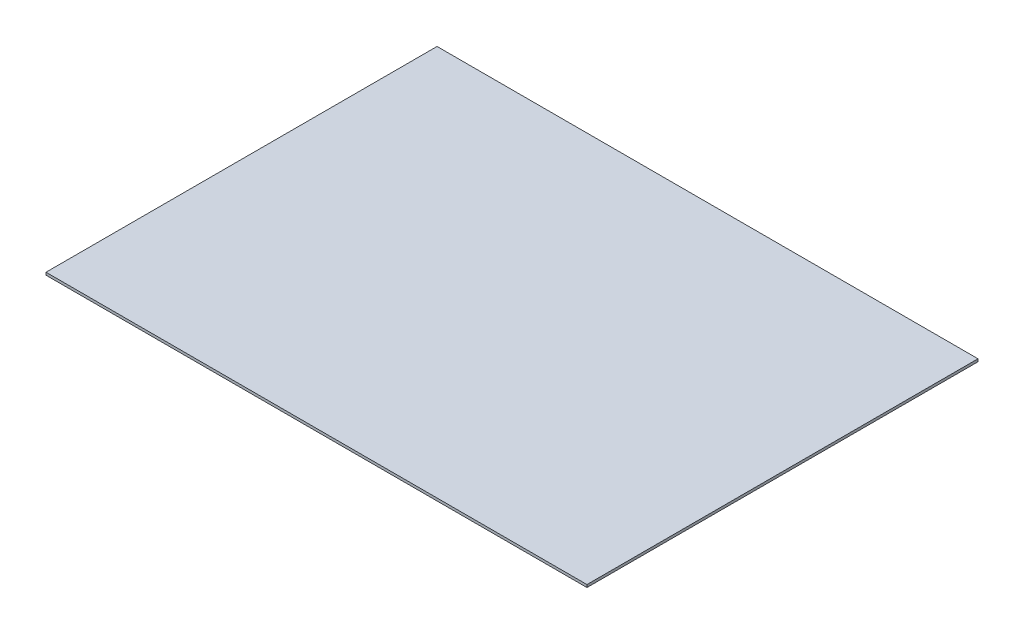
ISO-10303-21;
HEADER;
FILE_DESCRIPTION(('STEP AP214'),'2;1');
FILE_NAME('part.step','',(''),(''),'','','');
FILE_SCHEMA(('AUTOMOTIVE_DESIGN { 1 0 10303 214 1 1 1 1 }'));
ENDSEC;
DATA;
#1=APPLICATION_CONTEXT('core data for automotive mechanical design processes');
#2=APPLICATION_PROTOCOL_DEFINITION('international standard','automotive_design',2000,#1);
#3=PRODUCT_CONTEXT('',#1,'mechanical');
#4=PRODUCT('Part','Part','',(#3));
#5=PRODUCT_RELATED_PRODUCT_CATEGORY('part','',(#4));
#6=PRODUCT_DEFINITION_FORMATION('','',#4);
#7=PRODUCT_DEFINITION_CONTEXT('part definition',#1,'design');
#8=PRODUCT_DEFINITION('design','',#6,#7);
#9=PRODUCT_DEFINITION_SHAPE('','',#8);
#10=(LENGTH_UNIT() NAMED_UNIT(*) SI_UNIT(.MILLI.,.METRE.));
#11=(NAMED_UNIT(*) PLANE_ANGLE_UNIT() SI_UNIT($,.RADIAN.));
#12=(NAMED_UNIT(*) SI_UNIT($,.STERADIAN.) SOLID_ANGLE_UNIT());
#13=UNCERTAINTY_MEASURE_WITH_UNIT(LENGTH_MEASURE(1.E-05),#10,'distance_accuracy_value','');
#14=(GEOMETRIC_REPRESENTATION_CONTEXT(3) GLOBAL_UNCERTAINTY_ASSIGNED_CONTEXT((#13)) GLOBAL_UNIT_ASSIGNED_CONTEXT((#10,
#11,#12)) REPRESENTATION_CONTEXT('',''));
#15=CARTESIAN_POINT('',(0.,0.,0.));
#16=DIRECTION('',(0.,0.,1.));
#17=DIRECTION('',(1.,0.,0.));
#18=AXIS2_PLACEMENT_3D('',#15,#16,#17);
#19=CARTESIAN_POINT('',(0.,0.,0.));
#20=DIRECTION('',(0.,1.,0.));
#21=DIRECTION('',(0.,0.,1.));
#22=AXIS2_PLACEMENT_3D('',#19,#20,#21);
#23=PLANE('',#22);
#24=DIRECTION('',(0.,0.,-1.));
#25=VECTOR('',#24,1.);
#26=CARTESIAN_POINT('',(209.965722120658,0.,-135.804387568556));
#27=LINE('',#26,#25);
#28=CARTESIAN_POINT('',(209.965722120658,0.,164.195612431444));
#29=VERTEX_POINT('',#28);
#30=CARTESIAN_POINT('',(209.965722120658,0.,-135.804387568556));
#31=VERTEX_POINT('',#30);
#32=EDGE_CURVE('E166',#29,#31,#27,.T.);
#33=ORIENTED_EDGE('',*,*,#32,.F.);
#34=DIRECTION('',(1.,0.,0.));
#35=VECTOR('',#34,1.);
#36=CARTESIAN_POINT('',(-205.034277879342,0.,164.195612431444));
#37=LINE('',#36,#35);
#38=CARTESIAN_POINT('',(-205.034277879342,0.,164.195612431444));
#39=VERTEX_POINT('',#38);
#40=EDGE_CURVE('E183',#39,#29,#37,.T.);
#41=ORIENTED_EDGE('',*,*,#40,.F.);
#42=DIRECTION('',(0.,0.,1.));
#43=VECTOR('',#42,1.);
#44=CARTESIAN_POINT('',(-205.034277879342,0.,-135.804387568556));
#45=LINE('',#44,#43);
#46=CARTESIAN_POINT('',(-205.034277879342,0.,-135.804387568556));
#47=VERTEX_POINT('',#46);
#48=EDGE_CURVE('E194',#47,#39,#45,.T.);
#49=ORIENTED_EDGE('',*,*,#48,.F.);
#50=DIRECTION('',(-1.,0.,0.));
#51=VECTOR('',#50,1.);
#52=CARTESIAN_POINT('',(-205.034277879342,0.,-135.804387568556));
#53=LINE('',#52,#51);
#54=EDGE_CURVE('E192',#31,#47,#53,.T.);
#55=ORIENTED_EDGE('',*,*,#54,.F.);
#56=EDGE_LOOP('',(#33,#41,#49,#55));
#57=FACE_BOUND('',#56,.T.);
#58=DIRECTION('',(1.,0.,0.));
#59=VECTOR('',#58,1.);
#60=CARTESIAN_POINT('',(0.,0.,-120.804387568556));
#61=LINE('',#60,#59);
#62=CARTESIAN_POINT('',(-190.034277879342,0.,-120.804387568556));
#63=VERTEX_POINT('',#62);
#64=CARTESIAN_POINT('',(194.965722120658,0.,-120.804387568556));
#65=VERTEX_POINT('',#64);
#66=EDGE_CURVE('E11',#63,#65,#61,.T.);
#67=ORIENTED_EDGE('',*,*,#66,.F.);
#68=DIRECTION('',(0.,0.,1.));
#69=VECTOR('',#68,1.);
#70=CARTESIAN_POINT('',(-190.034277879342,0.,0.));
#71=LINE('',#70,#69);
#72=CARTESIAN_POINT('',(-190.034277879342,0.,149.195612431444));
#73=VERTEX_POINT('',#72);
#74=EDGE_CURVE('E131',#63,#73,#71,.T.);
#75=ORIENTED_EDGE('',*,*,#74,.T.);
#76=DIRECTION('',(1.,0.,0.));
#77=VECTOR('',#76,1.);
#78=CARTESIAN_POINT('',(0.,0.,149.195612431444));
#79=LINE('',#78,#77);
#80=CARTESIAN_POINT('',(194.965722120658,0.,149.195612431444));
#81=VERTEX_POINT('',#80);
#82=EDGE_CURVE('E219',#73,#81,#79,.T.);
#83=ORIENTED_EDGE('',*,*,#82,.T.);
#84=DIRECTION('',(0.,0.,1.));
#85=VECTOR('',#84,1.);
#86=CARTESIAN_POINT('',(194.965722120658,0.,0.));
#87=LINE('',#86,#85);
#88=EDGE_CURVE('E47',#65,#81,#87,.T.);
#89=ORIENTED_EDGE('',*,*,#88,.F.);
#90=EDGE_LOOP('',(#67,#75,#83,#89));
#91=FACE_BOUND('',#90,.T.);
#92=ADVANCED_FACE('F39',(#57,#91),#23,.F.);
#93=CARTESIAN_POINT('',(209.965722120658,2.,-135.804387568556));
#94=DIRECTION('',(-1.,0.,0.));
#95=DIRECTION('',(0.,0.,1.));
#96=AXIS2_PLACEMENT_3D('',#93,#94,#95);
#97=PLANE('',#96);
#98=ORIENTED_EDGE('',*,*,#32,.T.);
#99=DIRECTION('',(0.,-1.,0.));
#100=VECTOR('',#99,1.);
#101=CARTESIAN_POINT('',(209.965722120658,2.,-135.804387568556));
#102=LINE('',#101,#100);
#103=CARTESIAN_POINT('',(209.965722120658,2.,-135.804387568556));
#104=VERTEX_POINT('',#103);
#105=EDGE_CURVE('E205',#104,#31,#102,.T.);
#106=ORIENTED_EDGE('',*,*,#105,.F.);
#107=DIRECTION('',(0.,0.,-1.));
#108=VECTOR('',#107,1.);
#109=CARTESIAN_POINT('',(209.965722120658,2.,-135.804387568556));
#110=LINE('',#109,#108);
#111=CARTESIAN_POINT('',(209.965722120658,2.,164.195612431444));
#112=VERTEX_POINT('',#111);
#113=EDGE_CURVE('E179',#112,#104,#110,.T.);
#114=ORIENTED_EDGE('',*,*,#113,.F.);
#115=DIRECTION('',(0.,-1.,0.));
#116=VECTOR('',#115,1.);
#117=CARTESIAN_POINT('',(209.965722120658,2.,164.195612431444));
#118=LINE('',#117,#116);
#119=EDGE_CURVE('E189',#112,#29,#118,.T.);
#120=ORIENTED_EDGE('',*,*,#119,.T.);
#121=EDGE_LOOP('',(#98,#106,#114,#120));
#122=FACE_BOUND('',#121,.T.);
#123=ADVANCED_FACE('F41',(#122),#97,.F.);
#124=CARTESIAN_POINT('',(-205.034277879342,2.,-135.804387568556));
#125=DIRECTION('',(0.,0.,1.));
#126=DIRECTION('',(1.,0.,0.));
#127=AXIS2_PLACEMENT_3D('',#124,#125,#126);
#128=PLANE('',#127);
#129=ORIENTED_EDGE('',*,*,#54,.T.);
#130=DIRECTION('',(0.,-1.,0.));
#131=VECTOR('',#130,1.);
#132=CARTESIAN_POINT('',(-205.034277879342,2.,-135.804387568556));
#133=LINE('',#132,#131);
#134=CARTESIAN_POINT('',(-205.034277879342,2.,-135.804387568556));
#135=VERTEX_POINT('',#134);
#136=EDGE_CURVE('E202',#135,#47,#133,.T.);
#137=ORIENTED_EDGE('',*,*,#136,.F.);
#138=DIRECTION('',(-1.,0.,0.));
#139=VECTOR('',#138,1.);
#140=CARTESIAN_POINT('',(-205.034277879342,2.,-135.804387568556));
#141=LINE('',#140,#139);
#142=EDGE_CURVE('E182',#104,#135,#141,.T.);
#143=ORIENTED_EDGE('',*,*,#142,.F.);
#144=ORIENTED_EDGE('',*,*,#105,.T.);
#145=EDGE_LOOP('',(#129,#137,#143,#144));
#146=FACE_BOUND('',#145,.T.);
#147=ADVANCED_FACE('F235',(#146),#128,.F.);
#148=CARTESIAN_POINT('',(-205.034277879342,2.,-135.804387568556));
#149=DIRECTION('',(1.,0.,0.));
#150=DIRECTION('',(0.,0.,-1.));
#151=AXIS2_PLACEMENT_3D('',#148,#149,#150);
#152=PLANE('',#151);
#153=ORIENTED_EDGE('',*,*,#48,.T.);
#154=DIRECTION('',(0.,-1.,0.));
#155=VECTOR('',#154,1.);
#156=CARTESIAN_POINT('',(-205.034277879342,2.,164.195612431444));
#157=LINE('',#156,#155);
#158=CARTESIAN_POINT('',(-205.034277879342,2.,164.195612431444));
#159=VERTEX_POINT('',#158);
#160=EDGE_CURVE('E199',#159,#39,#157,.T.);
#161=ORIENTED_EDGE('',*,*,#160,.F.);
#162=DIRECTION('',(0.,0.,1.));
#163=VECTOR('',#162,1.);
#164=CARTESIAN_POINT('',(-205.034277879342,2.,-135.804387568556));
#165=LINE('',#164,#163);
#166=EDGE_CURVE('E185',#135,#159,#165,.T.);
#167=ORIENTED_EDGE('',*,*,#166,.F.);
#168=ORIENTED_EDGE('',*,*,#136,.T.);
#169=EDGE_LOOP('',(#153,#161,#167,#168));
#170=FACE_BOUND('',#169,.T.);
#171=ADVANCED_FACE('F282',(#170),#152,.F.);
#172=CARTESIAN_POINT('',(-205.034277879342,2.,164.195612431444));
#173=DIRECTION('',(0.,0.,-1.));
#174=DIRECTION('',(-1.,0.,0.));
#175=AXIS2_PLACEMENT_3D('',#172,#173,#174);
#176=PLANE('',#175);
#177=ORIENTED_EDGE('',*,*,#40,.T.);
#178=ORIENTED_EDGE('',*,*,#119,.F.);
#179=DIRECTION('',(1.,0.,0.));
#180=VECTOR('',#179,1.);
#181=CARTESIAN_POINT('',(-205.034277879342,2.,164.195612431444));
#182=LINE('',#181,#180);
#183=EDGE_CURVE('E187',#159,#112,#182,.T.);
#184=ORIENTED_EDGE('',*,*,#183,.F.);
#185=ORIENTED_EDGE('',*,*,#160,.T.);
#186=EDGE_LOOP('',(#177,#178,#184,#185));
#187=FACE_BOUND('',#186,.T.);
#188=ADVANCED_FACE('F277',(#187),#176,.F.);
#189=CARTESIAN_POINT('',(0.,2.,0.));
#190=DIRECTION('',(0.,1.,0.));
#191=DIRECTION('',(0.,0.,1.));
#192=AXIS2_PLACEMENT_3D('',#189,#190,#191);
#193=PLANE('',#192);
#194=ORIENTED_EDGE('',*,*,#113,.T.);
#195=ORIENTED_EDGE('',*,*,#142,.T.);
#196=ORIENTED_EDGE('',*,*,#166,.T.);
#197=ORIENTED_EDGE('',*,*,#183,.T.);
#198=EDGE_LOOP('',(#194,#195,#196,#197));
#199=FACE_BOUND('',#198,.T.);
#200=ADVANCED_FACE('F270',(#199),#193,.T.);
#201=CARTESIAN_POINT('',(-185.034277879342,-8.,0.));
#202=DIRECTION('',(-1.,0.,0.));
#203=DIRECTION('',(0.,0.,1.));
#204=AXIS2_PLACEMENT_3D('',#201,#202,#203);
#205=PLANE('',#204);
#206=DIRECTION('',(0.,1.,0.));
#207=VECTOR('',#206,1.);
#208=CARTESIAN_POINT('',(-185.034277879342,-8.,-115.804387568556));
#209=LINE('',#208,#207);
#210=CARTESIAN_POINT('',(-185.034277879342,-8.,-115.804387568556));
#211=VERTEX_POINT('',#210);
#212=CARTESIAN_POINT('',(-185.034277879342,0.,-115.804387568556));
#213=VERTEX_POINT('',#212);
#214=EDGE_CURVE('E171',#211,#213,#209,.T.);
#215=ORIENTED_EDGE('',*,*,#214,.T.);
#216=DIRECTION('',(0.,0.,1.));
#217=VECTOR('',#216,1.);
#218=CARTESIAN_POINT('',(-185.034277879342,0.,0.));
#219=LINE('',#218,#217);
#220=CARTESIAN_POINT('',(-185.034277879342,0.,144.195612431444));
#221=VERTEX_POINT('',#220);
#222=EDGE_CURVE('E216',#213,#221,#219,.T.);
#223=ORIENTED_EDGE('',*,*,#222,.T.);
#224=DIRECTION('',(0.,1.,0.));
#225=VECTOR('',#224,1.);
#226=CARTESIAN_POINT('',(-185.034277879342,-8.,144.195612431444));
#227=LINE('',#226,#225);
#228=CARTESIAN_POINT('',(-185.034277879342,-8.,144.195612431444));
#229=VERTEX_POINT('',#228);
#230=EDGE_CURVE('E163',#229,#221,#227,.T.);
#231=ORIENTED_EDGE('',*,*,#230,.F.);
#232=DIRECTION('',(0.,0.,1.));
#233=VECTOR('',#232,1.);
#234=CARTESIAN_POINT('',(-185.034277879342,-8.,0.));
#235=LINE('',#234,#233);
#236=EDGE_CURVE('E154',#211,#229,#235,.T.);
#237=ORIENTED_EDGE('',*,*,#236,.F.);
#238=EDGE_LOOP('',(#215,#223,#231,#237));
#239=FACE_BOUND('',#238,.T.);
#240=ADVANCED_FACE('F251',(#239),#205,.F.);
#241=CARTESIAN_POINT('',(0.,-8.,144.195612431444));
#242=DIRECTION('',(0.,0.,1.));
#243=DIRECTION('',(1.,0.,0.));
#244=AXIS2_PLACEMENT_3D('',#241,#242,#243);
#245=PLANE('',#244);
#246=ORIENTED_EDGE('',*,*,#230,.T.);
#247=DIRECTION('',(1.,0.,0.));
#248=VECTOR('',#247,1.);
#249=CARTESIAN_POINT('',(0.,0.,144.195612431444));
#250=LINE('',#249,#248);
#251=CARTESIAN_POINT('',(189.965722120658,0.,144.195612431444));
#252=VERTEX_POINT('',#251);
#253=EDGE_CURVE('E214',#221,#252,#250,.T.);
#254=ORIENTED_EDGE('',*,*,#253,.T.);
#255=DIRECTION('',(0.,1.,0.));
#256=VECTOR('',#255,1.);
#257=CARTESIAN_POINT('',(189.965722120658,-8.,144.195612431444));
#258=LINE('',#257,#256);
#259=CARTESIAN_POINT('',(189.965722120658,-8.,144.195612431444));
#260=VERTEX_POINT('',#259);
#261=EDGE_CURVE('E167',#260,#252,#258,.T.);
#262=ORIENTED_EDGE('',*,*,#261,.F.);
#263=DIRECTION('',(1.,0.,0.));
#264=VECTOR('',#263,1.);
#265=CARTESIAN_POINT('',(0.,-8.,144.195612431444));
#266=LINE('',#265,#264);
#267=EDGE_CURVE('E134',#229,#260,#266,.T.);
#268=ORIENTED_EDGE('',*,*,#267,.F.);
#269=EDGE_LOOP('',(#246,#254,#262,#268));
#270=FACE_BOUND('',#269,.T.);
#271=ADVANCED_FACE('F254',(#270),#245,.F.);
#272=CARTESIAN_POINT('',(189.965722120658,-8.,0.));
#273=DIRECTION('',(-1.,0.,0.));
#274=DIRECTION('',(0.,0.,1.));
#275=AXIS2_PLACEMENT_3D('',#272,#273,#274);
#276=PLANE('',#275);
#277=DIRECTION('',(0.,0.,1.));
#278=VECTOR('',#277,1.);
#279=CARTESIAN_POINT('',(189.965722120658,0.,0.));
#280=LINE('',#279,#278);
#281=CARTESIAN_POINT('',(189.965722120658,0.,-115.804387568556));
#282=VERTEX_POINT('',#281);
#283=EDGE_CURVE('E211',#282,#252,#280,.T.);
#284=ORIENTED_EDGE('',*,*,#283,.F.);
#285=DIRECTION('',(0.,1.,0.));
#286=VECTOR('',#285,1.);
#287=CARTESIAN_POINT('',(189.965722120658,-8.,-115.804387568556));
#288=LINE('',#287,#286);
#289=CARTESIAN_POINT('',(189.965722120658,-8.,-115.804387568556));
#290=VERTEX_POINT('',#289);
#291=EDGE_CURVE('E62',#290,#282,#288,.T.);
#292=ORIENTED_EDGE('',*,*,#291,.F.);
#293=DIRECTION('',(0.,0.,1.));
#294=VECTOR('',#293,1.);
#295=CARTESIAN_POINT('',(189.965722120658,-8.,0.));
#296=LINE('',#295,#294);
#297=EDGE_CURVE('E159',#290,#260,#296,.T.);
#298=ORIENTED_EDGE('',*,*,#297,.T.);
#299=ORIENTED_EDGE('',*,*,#261,.T.);
#300=EDGE_LOOP('',(#284,#292,#298,#299));
#301=FACE_BOUND('',#300,.T.);
#302=ADVANCED_FACE('F266',(#301),#276,.T.);
#303=CARTESIAN_POINT('',(0.,-8.,-120.804387568556));
#304=DIRECTION('',(0.,0.,1.));
#305=DIRECTION('',(1.,0.,0.));
#306=AXIS2_PLACEMENT_3D('',#303,#304,#305);
#307=PLANE('',#306);
#308=DIRECTION('',(0.,1.,0.));
#309=VECTOR('',#308,1.);
#310=CARTESIAN_POINT('',(-190.034277879342,-8.,-120.804387568556));
#311=LINE('',#310,#309);
#312=CARTESIAN_POINT('',(-190.034277879342,-8.,-120.804387568556));
#313=VERTEX_POINT('',#312);
#314=EDGE_CURVE('E125',#313,#63,#311,.T.);
#315=ORIENTED_EDGE('',*,*,#314,.T.);
#316=ORIENTED_EDGE('',*,*,#66,.T.);
#317=DIRECTION('',(0.,1.,0.));
#318=VECTOR('',#317,1.);
#319=CARTESIAN_POINT('',(194.965722120658,-8.,-120.804387568556));
#320=LINE('',#319,#318);
#321=CARTESIAN_POINT('',(194.965722120658,-8.,-120.804387568556));
#322=VERTEX_POINT('',#321);
#323=EDGE_CURVE('E141',#322,#65,#320,.T.);
#324=ORIENTED_EDGE('',*,*,#323,.F.);
#325=DIRECTION('',(1.,0.,0.));
#326=VECTOR('',#325,1.);
#327=CARTESIAN_POINT('',(0.,-8.,-120.804387568556));
#328=LINE('',#327,#326);
#329=EDGE_CURVE('E138',#313,#322,#328,.T.);
#330=ORIENTED_EDGE('',*,*,#329,.F.);
#331=EDGE_LOOP('',(#315,#316,#324,#330));
#332=FACE_BOUND('',#331,.T.);
#333=ADVANCED_FACE('F139',(#332),#307,.F.);
#334=CARTESIAN_POINT('',(194.965722120658,-8.,0.));
#335=DIRECTION('',(-1.,0.,0.));
#336=DIRECTION('',(0.,0.,1.));
#337=AXIS2_PLACEMENT_3D('',#334,#335,#336);
#338=PLANE('',#337);
#339=ORIENTED_EDGE('',*,*,#323,.T.);
#340=ORIENTED_EDGE('',*,*,#88,.T.);
#341=DIRECTION('',(0.,1.,0.));
#342=VECTOR('',#341,1.);
#343=CARTESIAN_POINT('',(194.965722120658,-8.,149.195612431444));
#344=LINE('',#343,#342);
#345=CARTESIAN_POINT('',(194.965722120658,-8.,149.195612431444));
#346=VERTEX_POINT('',#345);
#347=EDGE_CURVE('E175',#346,#81,#344,.T.);
#348=ORIENTED_EDGE('',*,*,#347,.F.);
#349=DIRECTION('',(0.,0.,1.));
#350=VECTOR('',#349,1.);
#351=CARTESIAN_POINT('',(194.965722120658,-8.,0.));
#352=LINE('',#351,#350);
#353=EDGE_CURVE('E150',#322,#346,#352,.T.);
#354=ORIENTED_EDGE('',*,*,#353,.F.);
#355=EDGE_LOOP('',(#339,#340,#348,#354));
#356=FACE_BOUND('',#355,.T.);
#357=ADVANCED_FACE('F224',(#356),#338,.F.);
#358=CARTESIAN_POINT('',(0.,-8.,149.195612431444));
#359=DIRECTION('',(0.,0.,1.));
#360=DIRECTION('',(1.,0.,0.));
#361=AXIS2_PLACEMENT_3D('',#358,#359,#360);
#362=PLANE('',#361);
#363=ORIENTED_EDGE('',*,*,#82,.F.);
#364=DIRECTION('',(0.,1.,0.));
#365=VECTOR('',#364,1.);
#366=CARTESIAN_POINT('',(-190.034277879342,-8.,149.195612431444));
#367=LINE('',#366,#365);
#368=CARTESIAN_POINT('',(-190.034277879342,-8.,149.195612431444));
#369=VERTEX_POINT('',#368);
#370=EDGE_CURVE('E54',#369,#73,#367,.T.);
#371=ORIENTED_EDGE('',*,*,#370,.F.);
#372=DIRECTION('',(1.,0.,0.));
#373=VECTOR('',#372,1.);
#374=CARTESIAN_POINT('',(0.,-8.,149.195612431444));
#375=LINE('',#374,#373);
#376=EDGE_CURVE('E148',#369,#346,#375,.T.);
#377=ORIENTED_EDGE('',*,*,#376,.T.);
#378=ORIENTED_EDGE('',*,*,#347,.T.);
#379=EDGE_LOOP('',(#363,#371,#377,#378));
#380=FACE_BOUND('',#379,.T.);
#381=ADVANCED_FACE('F227',(#380),#362,.T.);
#382=CARTESIAN_POINT('',(-190.034277879342,-8.,0.));
#383=DIRECTION('',(-1.,0.,0.));
#384=DIRECTION('',(0.,0.,1.));
#385=AXIS2_PLACEMENT_3D('',#382,#383,#384);
#386=PLANE('',#385);
#387=ORIENTED_EDGE('',*,*,#74,.F.);
#388=ORIENTED_EDGE('',*,*,#314,.F.);
#389=DIRECTION('',(0.,0.,1.));
#390=VECTOR('',#389,1.);
#391=CARTESIAN_POINT('',(-190.034277879342,-8.,0.));
#392=LINE('',#391,#390);
#393=EDGE_CURVE('E129',#313,#369,#392,.T.);
#394=ORIENTED_EDGE('',*,*,#393,.T.);
#395=ORIENTED_EDGE('',*,*,#370,.T.);
#396=EDGE_LOOP('',(#387,#388,#394,#395));
#397=FACE_BOUND('',#396,.T.);
#398=ADVANCED_FACE('F127',(#397),#386,.T.);
#399=CARTESIAN_POINT('',(0.,-8.,-115.804387568556));
#400=DIRECTION('',(0.,0.,1.));
#401=DIRECTION('',(1.,0.,0.));
#402=AXIS2_PLACEMENT_3D('',#399,#400,#401);
#403=PLANE('',#402);
#404=DIRECTION('',(1.,0.,0.));
#405=VECTOR('',#404,1.);
#406=CARTESIAN_POINT('',(0.,0.,-115.804387568556));
#407=LINE('',#406,#405);
#408=EDGE_CURVE('E208',#213,#282,#407,.T.);
#409=ORIENTED_EDGE('',*,*,#408,.F.);
#410=ORIENTED_EDGE('',*,*,#214,.F.);
#411=DIRECTION('',(1.,0.,0.));
#412=VECTOR('',#411,1.);
#413=CARTESIAN_POINT('',(0.,-8.,-115.804387568556));
#414=LINE('',#413,#412);
#415=EDGE_CURVE('E157',#211,#290,#414,.T.);
#416=ORIENTED_EDGE('',*,*,#415,.T.);
#417=ORIENTED_EDGE('',*,*,#291,.T.);
#418=EDGE_LOOP('',(#409,#410,#416,#417));
#419=FACE_BOUND('',#418,.T.);
#420=ADVANCED_FACE('F245',(#419),#403,.T.);
#421=CARTESIAN_POINT('',(0.,-8.,0.));
#422=DIRECTION('',(0.,1.,0.));
#423=DIRECTION('',(0.,0.,1.));
#424=AXIS2_PLACEMENT_3D('',#421,#422,#423);
#425=PLANE('',#424);
#426=ORIENTED_EDGE('',*,*,#329,.T.);
#427=ORIENTED_EDGE('',*,*,#353,.T.);
#428=ORIENTED_EDGE('',*,*,#376,.F.);
#429=ORIENTED_EDGE('',*,*,#393,.F.);
#430=EDGE_LOOP('',(#426,#427,#428,#429));
#431=FACE_BOUND('',#430,.T.);
#432=ORIENTED_EDGE('',*,*,#236,.T.);
#433=ORIENTED_EDGE('',*,*,#267,.T.);
#434=ORIENTED_EDGE('',*,*,#297,.F.);
#435=ORIENTED_EDGE('',*,*,#415,.F.);
#436=EDGE_LOOP('',(#432,#433,#434,#435));
#437=FACE_BOUND('',#436,.T.);
#438=ADVANCED_FACE('F145',(#431,#437),#425,.F.);
#439=ORIENTED_EDGE('',*,*,#222,.F.);
#440=ORIENTED_EDGE('',*,*,#408,.T.);
#441=ORIENTED_EDGE('',*,*,#283,.T.);
#442=ORIENTED_EDGE('',*,*,#253,.F.);
#443=EDGE_LOOP('',(#439,#440,#441,#442));
#444=FACE_BOUND('',#443,.T.);
#445=ADVANCED_FACE('F231',(#444),#23,.F.);
#446=CLOSED_SHELL('',(#92,#123,#147,#171,#188,#200,#240,#271,#302,#333,#357,#381,#398,#420,#438,#445));
#447=MANIFOLD_SOLID_BREP('B2',#446);
#448=ADVANCED_BREP_SHAPE_REPRESENTATION('',(#18,#447),#14);
#449=SHAPE_DEFINITION_REPRESENTATION(#9,#448);
ENDSEC;
END-ISO-10303-21;
